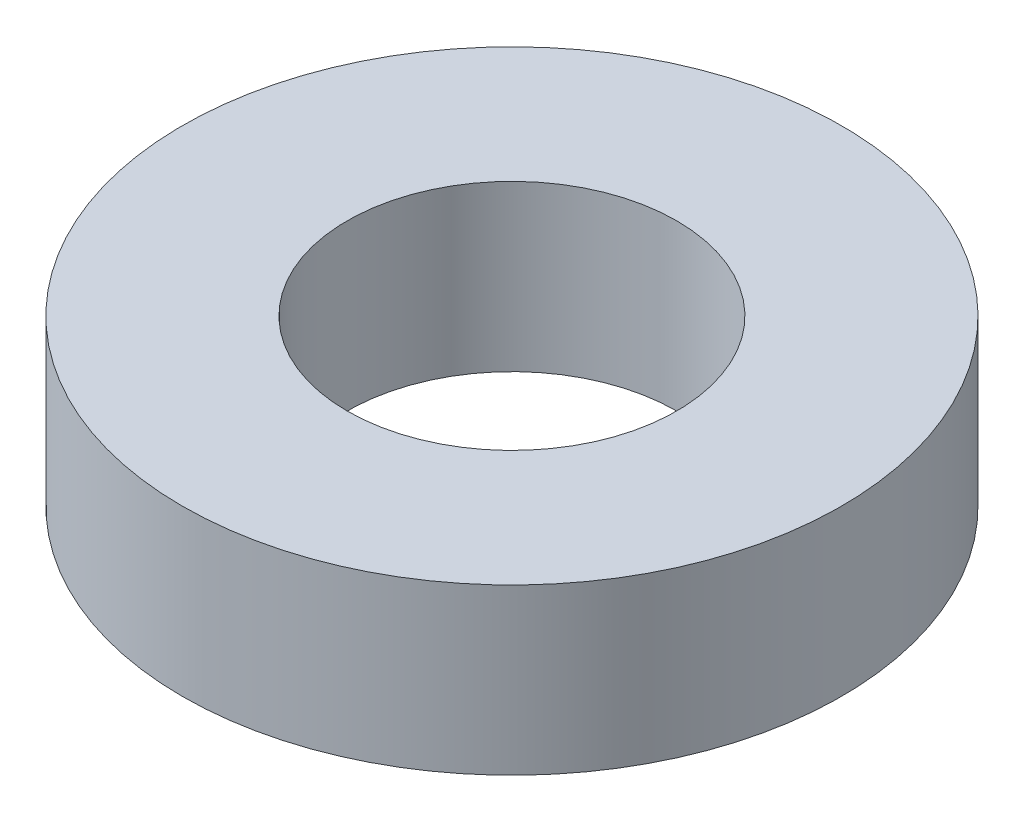
ISO-10303-21;
HEADER;
FILE_DESCRIPTION(('STEP AP214'),'2;1');
FILE_NAME('part.step','',(''),(''),'','','');
FILE_SCHEMA(('AUTOMOTIVE_DESIGN { 1 0 10303 214 1 1 1 1 }'));
ENDSEC;
DATA;
#1=APPLICATION_CONTEXT('core data for automotive mechanical design processes');
#2=APPLICATION_PROTOCOL_DEFINITION('international standard','automotive_design',2000,#1);
#3=PRODUCT_CONTEXT('',#1,'mechanical');
#4=PRODUCT('Part','Part','',(#3));
#5=PRODUCT_RELATED_PRODUCT_CATEGORY('part','',(#4));
#6=PRODUCT_DEFINITION_FORMATION('','',#4);
#7=PRODUCT_DEFINITION_CONTEXT('part definition',#1,'design');
#8=PRODUCT_DEFINITION('design','',#6,#7);
#9=PRODUCT_DEFINITION_SHAPE('','',#8);
#10=(LENGTH_UNIT() NAMED_UNIT(*) SI_UNIT(.MILLI.,.METRE.));
#11=(NAMED_UNIT(*) PLANE_ANGLE_UNIT() SI_UNIT($,.RADIAN.));
#12=(NAMED_UNIT(*) SI_UNIT($,.STERADIAN.) SOLID_ANGLE_UNIT());
#13=UNCERTAINTY_MEASURE_WITH_UNIT(LENGTH_MEASURE(1.E-05),#10,'distance_accuracy_value','');
#14=(GEOMETRIC_REPRESENTATION_CONTEXT(3) GLOBAL_UNCERTAINTY_ASSIGNED_CONTEXT((#13)) GLOBAL_UNIT_ASSIGNED_CONTEXT((#10,
#11,#12)) REPRESENTATION_CONTEXT('',''));
#15=CARTESIAN_POINT('',(0.,0.,0.));
#16=DIRECTION('',(0.,0.,1.));
#17=DIRECTION('',(1.,0.,0.));
#18=AXIS2_PLACEMENT_3D('',#15,#16,#17);
#19=CARTESIAN_POINT('',(0.,6.35,0.));
#20=DIRECTION('',(0.,1.,0.));
#21=DIRECTION('',(0.,0.,1.));
#22=AXIS2_PLACEMENT_3D('',#19,#20,#21);
#23=PLANE('',#22);
#24=CARTESIAN_POINT('',(0.,6.35,0.));
#25=DIRECTION('',(0.,1.,0.));
#26=DIRECTION('',(0.,0.,1.));
#27=AXIS2_PLACEMENT_3D('',#24,#25,#26);
#28=CIRCLE('',#27,12.7);
#29=CARTESIAN_POINT('',(0.,6.35,12.7));
#30=VERTEX_POINT('',#29);
#31=EDGE_CURVE('E10',#30,#30,#28,.T.);
#32=ORIENTED_EDGE('',*,*,#31,.T.);
#33=EDGE_LOOP('',(#32));
#34=FACE_BOUND('',#33,.T.);
#35=CARTESIAN_POINT('',(0.,6.35,0.));
#36=DIRECTION('',(0.,1.,0.));
#37=DIRECTION('',(0.,0.,1.));
#38=AXIS2_PLACEMENT_3D('',#35,#36,#37);
#39=CIRCLE('',#38,6.35);
#40=CARTESIAN_POINT('',(0.,6.35,6.35));
#41=VERTEX_POINT('',#40);
#42=EDGE_CURVE('E41',#41,#41,#39,.T.);
#43=ORIENTED_EDGE('',*,*,#42,.F.);
#44=EDGE_LOOP('',(#43));
#45=FACE_BOUND('',#44,.T.);
#46=ADVANCED_FACE('F30',(#34,#45),#23,.T.);
#47=CARTESIAN_POINT('',(0.,0.,0.));
#48=DIRECTION('',(0.,1.,0.));
#49=DIRECTION('',(0.,0.,1.));
#50=AXIS2_PLACEMENT_3D('',#47,#48,#49);
#51=PLANE('',#50);
#52=CARTESIAN_POINT('',(0.,0.,0.));
#53=DIRECTION('',(0.,1.,0.));
#54=DIRECTION('',(0.,0.,1.));
#55=AXIS2_PLACEMENT_3D('',#52,#53,#54);
#56=CIRCLE('',#55,12.7);
#57=CARTESIAN_POINT('',(0.,0.,12.7));
#58=VERTEX_POINT('',#57);
#59=EDGE_CURVE('E34',#58,#58,#56,.T.);
#60=ORIENTED_EDGE('',*,*,#59,.F.);
#61=EDGE_LOOP('',(#60));
#62=FACE_BOUND('',#61,.T.);
#63=CARTESIAN_POINT('',(0.,0.,0.));
#64=DIRECTION('',(0.,1.,0.));
#65=DIRECTION('',(0.,0.,1.));
#66=AXIS2_PLACEMENT_3D('',#63,#64,#65);
#67=CIRCLE('',#66,6.35);
#68=CARTESIAN_POINT('',(0.,0.,6.35));
#69=VERTEX_POINT('',#68);
#70=EDGE_CURVE('E43',#69,#69,#67,.T.);
#71=ORIENTED_EDGE('',*,*,#70,.T.);
#72=EDGE_LOOP('',(#71));
#73=FACE_BOUND('',#72,.T.);
#74=ADVANCED_FACE('F53',(#62,#73),#51,.F.);
#75=CARTESIAN_POINT('',(0.,6.35,0.));
#76=DIRECTION('',(0.,-1.,0.));
#77=DIRECTION('',(0.,0.,-1.));
#78=AXIS2_PLACEMENT_3D('',#75,#76,#77);
#79=CYLINDRICAL_SURFACE('',#78,12.7);
#80=ORIENTED_EDGE('',*,*,#31,.F.);
#81=EDGE_LOOP('',(#80));
#82=FACE_BOUND('',#81,.T.);
#83=ORIENTED_EDGE('',*,*,#59,.T.);
#84=EDGE_LOOP('',(#83));
#85=FACE_BOUND('',#84,.T.);
#86=ADVANCED_FACE('F32',(#82,#85),#79,.T.);
#87=CARTESIAN_POINT('',(0.,6.35,0.));
#88=DIRECTION('',(0.,-1.,0.));
#89=DIRECTION('',(0.,0.,-1.));
#90=AXIS2_PLACEMENT_3D('',#87,#88,#89);
#91=CYLINDRICAL_SURFACE('',#90,6.35);
#92=ORIENTED_EDGE('',*,*,#42,.T.);
#93=EDGE_LOOP('',(#92));
#94=FACE_BOUND('',#93,.T.);
#95=ORIENTED_EDGE('',*,*,#70,.F.);
#96=EDGE_LOOP('',(#95));
#97=FACE_BOUND('',#96,.T.);
#98=ADVANCED_FACE('F49',(#94,#97),#91,.F.);
#99=CLOSED_SHELL('',(#46,#74,#86,#98));
#100=MANIFOLD_SOLID_BREP('B2',#99);
#101=ADVANCED_BREP_SHAPE_REPRESENTATION('',(#18,#100),#14);
#102=SHAPE_DEFINITION_REPRESENTATION(#9,#101);
ENDSEC;
END-ISO-10303-21;
